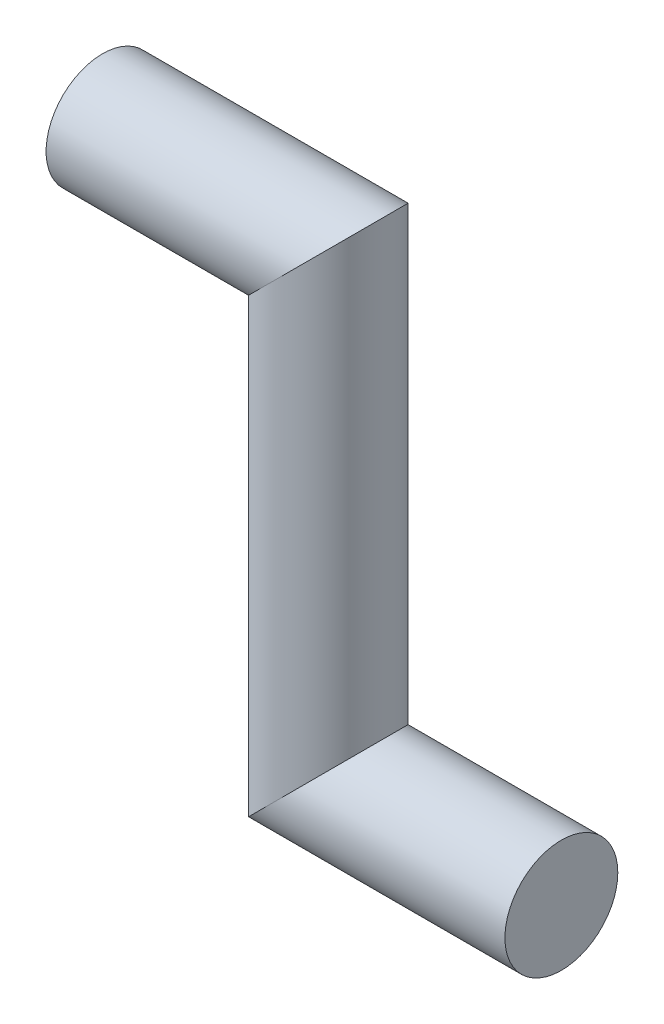
ISO-10303-21;
HEADER;
FILE_DESCRIPTION(('STEP AP214'),'2;1');
FILE_NAME('part.step','',(''),(''),'','','');
FILE_SCHEMA(('AUTOMOTIVE_DESIGN { 1 0 10303 214 1 1 1 1 }'));
ENDSEC;
DATA;
#1=APPLICATION_CONTEXT('core data for automotive mechanical design processes');
#2=APPLICATION_PROTOCOL_DEFINITION('international standard','automotive_design',2000,#1);
#3=PRODUCT_CONTEXT('',#1,'mechanical');
#4=PRODUCT('Part','Part','',(#3));
#5=PRODUCT_RELATED_PRODUCT_CATEGORY('part','',(#4));
#6=PRODUCT_DEFINITION_FORMATION('','',#4);
#7=PRODUCT_DEFINITION_CONTEXT('part definition',#1,'design');
#8=PRODUCT_DEFINITION('design','',#6,#7);
#9=PRODUCT_DEFINITION_SHAPE('','',#8);
#10=(LENGTH_UNIT() NAMED_UNIT(*) SI_UNIT(.MILLI.,.METRE.));
#11=(NAMED_UNIT(*) PLANE_ANGLE_UNIT() SI_UNIT($,.RADIAN.));
#12=(NAMED_UNIT(*) SI_UNIT($,.STERADIAN.) SOLID_ANGLE_UNIT());
#13=UNCERTAINTY_MEASURE_WITH_UNIT(LENGTH_MEASURE(1.E-05),#10,'distance_accuracy_value','');
#14=(GEOMETRIC_REPRESENTATION_CONTEXT(3) GLOBAL_UNCERTAINTY_ASSIGNED_CONTEXT((#13)) GLOBAL_UNIT_ASSIGNED_CONTEXT((#10,
#11,#12)) REPRESENTATION_CONTEXT('',''));
#15=CARTESIAN_POINT('',(0.,0.,0.));
#16=DIRECTION('',(0.,0.,1.));
#17=DIRECTION('',(1.,0.,0.));
#18=AXIS2_PLACEMENT_3D('',#15,#16,#17);
#19=CARTESIAN_POINT('',(20.32,-20.,0.));
#20=DIRECTION('',(1.,0.,0.));
#21=DIRECTION('',(0.,0.,-1.));
#22=AXIS2_PLACEMENT_3D('',#19,#20,#21);
#23=PLANE('',#22);
#24=CARTESIAN_POINT('',(20.32,-20.,0.));
#25=DIRECTION('',(1.,0.,0.));
#26=DIRECTION('',(0.,0.,-1.));
#27=AXIS2_PLACEMENT_3D('',#24,#25,#26);
#28=CIRCLE('',#27,2.5);
#29=CARTESIAN_POINT('',(20.32,-20.,-2.5));
#30=VERTEX_POINT('',#29);
#31=EDGE_CURVE('E34',#30,#30,#28,.T.);
#32=ORIENTED_EDGE('',*,*,#31,.T.);
#33=EDGE_LOOP('',(#32));
#34=FACE_BOUND('',#33,.T.);
#35=ADVANCED_FACE('F31',(#34),#23,.T.);
#36=CARTESIAN_POINT('',(0.,0.,0.));
#37=DIRECTION('',(1.,0.,0.));
#38=DIRECTION('',(0.,0.,-1.));
#39=AXIS2_PLACEMENT_3D('',#36,#37,#38);
#40=PLANE('',#39);
#41=CARTESIAN_POINT('',(0.,0.,0.));
#42=DIRECTION('',(1.,0.,0.));
#43=DIRECTION('',(0.,0.,-1.));
#44=AXIS2_PLACEMENT_3D('',#41,#42,#43);
#45=CIRCLE('',#44,2.5);
#46=CARTESIAN_POINT('',(0.,0.,-2.5));
#47=VERTEX_POINT('',#46);
#48=EDGE_CURVE('E38',#47,#47,#45,.T.);
#49=ORIENTED_EDGE('',*,*,#48,.F.);
#50=EDGE_LOOP('',(#49));
#51=FACE_BOUND('',#50,.T.);
#52=ADVANCED_FACE('F55',(#51),#40,.F.);
#53=CARTESIAN_POINT('',(4.4,-20.,0.));
#54=DIRECTION('',(1.,0.,0.));
#55=DIRECTION('',(0.,0.,-1.));
#56=AXIS2_PLACEMENT_3D('',#53,#54,#55);
#57=CYLINDRICAL_SURFACE('',#56,2.5);
#58=CARTESIAN_POINT('',(10.,-20.,0.));
#59=DIRECTION('',(0.707106781186547,-0.707106781186547,0.));
#60=DIRECTION('',(-0.707106781186548,-0.707106781186548,0.));
#61=AXIS2_PLACEMENT_3D('',#58,#59,#60);
#62=ELLIPSE('',#61,3.53553390593274,2.5);
#63=CARTESIAN_POINT('',(7.5,-22.5,0.));
#64=VERTEX_POINT('',#63);
#65=EDGE_CURVE('E43',#64,#64,#62,.F.);
#66=ORIENTED_EDGE('',*,*,#65,.F.);
#67=EDGE_LOOP('',(#66));
#68=FACE_BOUND('',#67,.T.);
#69=ORIENTED_EDGE('',*,*,#31,.F.);
#70=EDGE_LOOP('',(#69));
#71=FACE_BOUND('',#70,.T.);
#72=ADVANCED_FACE('F52',(#68,#71),#57,.T.);
#73=CARTESIAN_POINT('',(10.,5.6,0.));
#74=DIRECTION('',(0.,-1.,0.));
#75=DIRECTION('',(1.,0.,0.));
#76=AXIS2_PLACEMENT_3D('',#73,#74,#75);
#77=CYLINDRICAL_SURFACE('',#76,2.5);
#78=CARTESIAN_POINT('',(10.,0.,0.));
#79=DIRECTION('',(0.707106781186548,-0.707106781186548,0.));
#80=DIRECTION('',(0.707106781186548,0.707106781186548,0.));
#81=AXIS2_PLACEMENT_3D('',#78,#79,#80);
#82=ELLIPSE('',#81,3.53553390593274,2.5);
#83=CARTESIAN_POINT('',(12.5,2.5,0.));
#84=VERTEX_POINT('',#83);
#85=EDGE_CURVE('E10',#84,#84,#82,.F.);
#86=ORIENTED_EDGE('',*,*,#85,.F.);
#87=EDGE_LOOP('',(#86));
#88=FACE_BOUND('',#87,.T.);
#89=ORIENTED_EDGE('',*,*,#65,.T.);
#90=EDGE_LOOP('',(#89));
#91=FACE_BOUND('',#90,.T.);
#92=ADVANCED_FACE('F54',(#88,#91),#77,.T.);
#93=CARTESIAN_POINT('',(0.,0.,0.));
#94=DIRECTION('',(1.,0.,0.));
#95=DIRECTION('',(0.,0.,-1.));
#96=AXIS2_PLACEMENT_3D('',#93,#94,#95);
#97=CYLINDRICAL_SURFACE('',#96,2.5);
#98=ORIENTED_EDGE('',*,*,#48,.T.);
#99=EDGE_LOOP('',(#98));
#100=FACE_BOUND('',#99,.T.);
#101=ORIENTED_EDGE('',*,*,#85,.T.);
#102=EDGE_LOOP('',(#101));
#103=FACE_BOUND('',#102,.T.);
#104=ADVANCED_FACE('F62',(#100,#103),#97,.T.);
#105=CLOSED_SHELL('',(#35,#52,#72,#92,#104));
#106=MANIFOLD_SOLID_BREP('B2',#105);
#107=ADVANCED_BREP_SHAPE_REPRESENTATION('',(#18,#106),#14);
#108=SHAPE_DEFINITION_REPRESENTATION(#9,#107);
ENDSEC;
END-ISO-10303-21;
